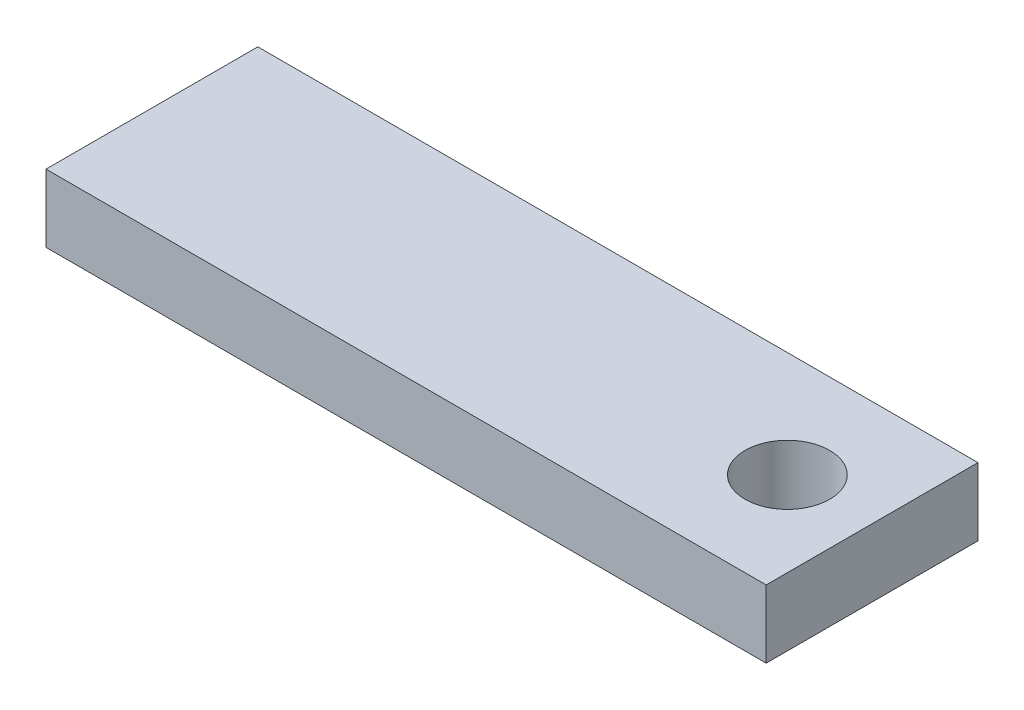
ISO-10303-21;
HEADER;
FILE_DESCRIPTION(('STEP AP214'),'2;1');
FILE_NAME('part.step','',(''),(''),'','','');
FILE_SCHEMA(('AUTOMOTIVE_DESIGN { 1 0 10303 214 1 1 1 1 }'));
ENDSEC;
DATA;
#1=APPLICATION_CONTEXT('core data for automotive mechanical design processes');
#2=APPLICATION_PROTOCOL_DEFINITION('international standard','automotive_design',2000,#1);
#3=PRODUCT_CONTEXT('',#1,'mechanical');
#4=PRODUCT('Part','Part','',(#3));
#5=PRODUCT_RELATED_PRODUCT_CATEGORY('part','',(#4));
#6=PRODUCT_DEFINITION_FORMATION('','',#4);
#7=PRODUCT_DEFINITION_CONTEXT('part definition',#1,'design');
#8=PRODUCT_DEFINITION('design','',#6,#7);
#9=PRODUCT_DEFINITION_SHAPE('','',#8);
#10=(LENGTH_UNIT() NAMED_UNIT(*) SI_UNIT(.MILLI.,.METRE.));
#11=(NAMED_UNIT(*) PLANE_ANGLE_UNIT() SI_UNIT($,.RADIAN.));
#12=(NAMED_UNIT(*) SI_UNIT($,.STERADIAN.) SOLID_ANGLE_UNIT());
#13=UNCERTAINTY_MEASURE_WITH_UNIT(LENGTH_MEASURE(1.E-05),#10,'distance_accuracy_value','');
#14=(GEOMETRIC_REPRESENTATION_CONTEXT(3) GLOBAL_UNCERTAINTY_ASSIGNED_CONTEXT((#13)) GLOBAL_UNIT_ASSIGNED_CONTEXT((#10,
#11,#12)) REPRESENTATION_CONTEXT('',''));
#15=CARTESIAN_POINT('',(0.,0.,0.));
#16=DIRECTION('',(0.,0.,1.));
#17=DIRECTION('',(1.,0.,0.));
#18=AXIS2_PLACEMENT_3D('',#15,#16,#17);
#19=CARTESIAN_POINT('',(0.,1.6,0.));
#20=DIRECTION('',(0.,1.,0.));
#21=DIRECTION('',(0.,0.,1.));
#22=AXIS2_PLACEMENT_3D('',#19,#20,#21);
#23=PLANE('',#22);
#24=DIRECTION('',(0.,0.,1.));
#25=VECTOR('',#24,1.);
#26=CARTESIAN_POINT('',(0.,1.6,-5.));
#27=LINE('',#26,#25);
#28=CARTESIAN_POINT('',(0.,1.6,-5.));
#29=VERTEX_POINT('',#28);
#30=CARTESIAN_POINT('',(0.,1.6,0.));
#31=VERTEX_POINT('',#30);
#32=EDGE_CURVE('E85',#29,#31,#27,.T.);
#33=ORIENTED_EDGE('',*,*,#32,.T.);
#34=DIRECTION('',(1.,0.,0.));
#35=VECTOR('',#34,1.);
#36=CARTESIAN_POINT('',(0.,1.6,0.));
#37=LINE('',#36,#35);
#38=CARTESIAN_POINT('',(17.,1.6,0.));
#39=VERTEX_POINT('',#38);
#40=EDGE_CURVE('E80',#31,#39,#37,.T.);
#41=ORIENTED_EDGE('',*,*,#40,.T.);
#42=DIRECTION('',(0.,0.,-1.));
#43=VECTOR('',#42,1.);
#44=CARTESIAN_POINT('',(17.,1.6,-5.));
#45=LINE('',#44,#43);
#46=CARTESIAN_POINT('',(17.,1.6,-5.));
#47=VERTEX_POINT('',#46);
#48=EDGE_CURVE('E83',#39,#47,#45,.T.);
#49=ORIENTED_EDGE('',*,*,#48,.T.);
#50=DIRECTION('',(-1.,0.,0.));
#51=VECTOR('',#50,1.);
#52=CARTESIAN_POINT('',(0.,1.6,-5.));
#53=LINE('',#52,#51);
#54=EDGE_CURVE('E50',#47,#29,#53,.T.);
#55=ORIENTED_EDGE('',*,*,#54,.T.);
#56=EDGE_LOOP('',(#33,#41,#49,#55));
#57=FACE_BOUND('',#56,.T.);
#58=CARTESIAN_POINT('',(15.,1.6,-2.5));
#59=DIRECTION('',(0.,1.,0.));
#60=DIRECTION('',(0.,0.,1.));
#61=AXIS2_PLACEMENT_3D('',#58,#59,#60);
#62=CIRCLE('',#61,1.);
#63=CARTESIAN_POINT('',(15.,1.6,-1.5));
#64=VERTEX_POINT('',#63);
#65=EDGE_CURVE('E100',#64,#64,#62,.T.);
#66=ORIENTED_EDGE('',*,*,#65,.F.);
#67=EDGE_LOOP('',(#66));
#68=FACE_BOUND('',#67,.T.);
#69=ADVANCED_FACE('F33',(#57,#68),#23,.T.);
#70=CARTESIAN_POINT('',(0.,0.,0.));
#71=DIRECTION('',(0.,1.,0.));
#72=DIRECTION('',(0.,0.,1.));
#73=AXIS2_PLACEMENT_3D('',#70,#71,#72);
#74=PLANE('',#73);
#75=DIRECTION('',(0.,0.,1.));
#76=VECTOR('',#75,1.);
#77=CARTESIAN_POINT('',(0.,0.,-5.));
#78=LINE('',#77,#76);
#79=CARTESIAN_POINT('',(0.,0.,-5.));
#80=VERTEX_POINT('',#79);
#81=CARTESIAN_POINT('',(0.,0.,0.));
#82=VERTEX_POINT('',#81);
#83=EDGE_CURVE('E97',#80,#82,#78,.T.);
#84=ORIENTED_EDGE('',*,*,#83,.F.);
#85=DIRECTION('',(-1.,0.,0.));
#86=VECTOR('',#85,1.);
#87=CARTESIAN_POINT('',(0.,0.,-5.));
#88=LINE('',#87,#86);
#89=CARTESIAN_POINT('',(17.,0.,-5.));
#90=VERTEX_POINT('',#89);
#91=EDGE_CURVE('E73',#90,#80,#88,.T.);
#92=ORIENTED_EDGE('',*,*,#91,.F.);
#93=DIRECTION('',(0.,0.,-1.));
#94=VECTOR('',#93,1.);
#95=CARTESIAN_POINT('',(17.,0.,-5.));
#96=LINE('',#95,#94);
#97=CARTESIAN_POINT('',(17.,0.,0.));
#98=VERTEX_POINT('',#97);
#99=EDGE_CURVE('E67',#98,#90,#96,.T.);
#100=ORIENTED_EDGE('',*,*,#99,.F.);
#101=DIRECTION('',(1.,0.,0.));
#102=VECTOR('',#101,1.);
#103=CARTESIAN_POINT('',(0.,0.,0.));
#104=LINE('',#103,#102);
#105=EDGE_CURVE('E89',#82,#98,#104,.T.);
#106=ORIENTED_EDGE('',*,*,#105,.F.);
#107=EDGE_LOOP('',(#84,#92,#100,#106));
#108=FACE_BOUND('',#107,.T.);
#109=CARTESIAN_POINT('',(15.,0.,-2.5));
#110=DIRECTION('',(0.,1.,0.));
#111=DIRECTION('',(0.,0.,1.));
#112=AXIS2_PLACEMENT_3D('',#109,#110,#111);
#113=CIRCLE('',#112,1.);
#114=CARTESIAN_POINT('',(15.,0.,-1.5));
#115=VERTEX_POINT('',#114);
#116=EDGE_CURVE('E112',#115,#115,#113,.T.);
#117=ORIENTED_EDGE('',*,*,#116,.T.);
#118=EDGE_LOOP('',(#117));
#119=FACE_BOUND('',#118,.T.);
#120=ADVANCED_FACE('F108',(#108,#119),#74,.F.);
#121=CARTESIAN_POINT('',(0.,1.6,-5.));
#122=DIRECTION('',(1.,0.,0.));
#123=DIRECTION('',(0.,0.,-1.));
#124=AXIS2_PLACEMENT_3D('',#121,#122,#123);
#125=PLANE('',#124);
#126=ORIENTED_EDGE('',*,*,#83,.T.);
#127=DIRECTION('',(0.,-1.,0.));
#128=VECTOR('',#127,1.);
#129=CARTESIAN_POINT('',(0.,1.6,0.));
#130=LINE('',#129,#128);
#131=EDGE_CURVE('E11',#31,#82,#130,.T.);
#132=ORIENTED_EDGE('',*,*,#131,.F.);
#133=ORIENTED_EDGE('',*,*,#32,.F.);
#134=DIRECTION('',(0.,-1.,0.));
#135=VECTOR('',#134,1.);
#136=CARTESIAN_POINT('',(0.,1.6,-5.));
#137=LINE('',#136,#135);
#138=EDGE_CURVE('E93',#29,#80,#137,.T.);
#139=ORIENTED_EDGE('',*,*,#138,.T.);
#140=EDGE_LOOP('',(#126,#132,#133,#139));
#141=FACE_BOUND('',#140,.T.);
#142=ADVANCED_FACE('F35',(#141),#125,.F.);
#143=CARTESIAN_POINT('',(0.,1.6,0.));
#144=DIRECTION('',(0.,0.,-1.));
#145=DIRECTION('',(-1.,0.,0.));
#146=AXIS2_PLACEMENT_3D('',#143,#144,#145);
#147=PLANE('',#146);
#148=ORIENTED_EDGE('',*,*,#105,.T.);
#149=DIRECTION('',(0.,-1.,0.));
#150=VECTOR('',#149,1.);
#151=CARTESIAN_POINT('',(17.,1.6,0.));
#152=LINE('',#151,#150);
#153=EDGE_CURVE('E42',#39,#98,#152,.T.);
#154=ORIENTED_EDGE('',*,*,#153,.F.);
#155=ORIENTED_EDGE('',*,*,#40,.F.);
#156=ORIENTED_EDGE('',*,*,#131,.T.);
#157=EDGE_LOOP('',(#148,#154,#155,#156));
#158=FACE_BOUND('',#157,.T.);
#159=ADVANCED_FACE('F88',(#158),#147,.F.);
#160=CARTESIAN_POINT('',(17.,1.6,-5.));
#161=DIRECTION('',(-1.,0.,0.));
#162=DIRECTION('',(0.,0.,1.));
#163=AXIS2_PLACEMENT_3D('',#160,#161,#162);
#164=PLANE('',#163);
#165=ORIENTED_EDGE('',*,*,#99,.T.);
#166=DIRECTION('',(0.,-1.,0.));
#167=VECTOR('',#166,1.);
#168=CARTESIAN_POINT('',(17.,1.6,-5.));
#169=LINE('',#168,#167);
#170=EDGE_CURVE('E90',#47,#90,#169,.T.);
#171=ORIENTED_EDGE('',*,*,#170,.F.);
#172=ORIENTED_EDGE('',*,*,#48,.F.);
#173=ORIENTED_EDGE('',*,*,#153,.T.);
#174=EDGE_LOOP('',(#165,#171,#172,#173));
#175=FACE_BOUND('',#174,.T.);
#176=ADVANCED_FACE('F91',(#175),#164,.F.);
#177=CARTESIAN_POINT('',(0.,1.6,-5.));
#178=DIRECTION('',(0.,0.,1.));
#179=DIRECTION('',(1.,0.,0.));
#180=AXIS2_PLACEMENT_3D('',#177,#178,#179);
#181=PLANE('',#180);
#182=ORIENTED_EDGE('',*,*,#91,.T.);
#183=ORIENTED_EDGE('',*,*,#138,.F.);
#184=ORIENTED_EDGE('',*,*,#54,.F.);
#185=ORIENTED_EDGE('',*,*,#170,.T.);
#186=EDGE_LOOP('',(#182,#183,#184,#185));
#187=FACE_BOUND('',#186,.T.);
#188=ADVANCED_FACE('F105',(#187),#181,.F.);
#189=CARTESIAN_POINT('',(15.,1.6,-2.5));
#190=DIRECTION('',(0.,-1.,0.));
#191=DIRECTION('',(0.,0.,-1.));
#192=AXIS2_PLACEMENT_3D('',#189,#190,#191);
#193=CYLINDRICAL_SURFACE('',#192,1.);
#194=ORIENTED_EDGE('',*,*,#65,.T.);
#195=EDGE_LOOP('',(#194));
#196=FACE_BOUND('',#195,.T.);
#197=ORIENTED_EDGE('',*,*,#116,.F.);
#198=EDGE_LOOP('',(#197));
#199=FACE_BOUND('',#198,.T.);
#200=ADVANCED_FACE('F118',(#196,#199),#193,.F.);
#201=CLOSED_SHELL('',(#69,#120,#142,#159,#176,#188,#200));
#202=MANIFOLD_SOLID_BREP('B2',#201);
#203=ADVANCED_BREP_SHAPE_REPRESENTATION('',(#18,#202),#14);
#204=SHAPE_DEFINITION_REPRESENTATION(#9,#203);
ENDSEC;
END-ISO-10303-21;
